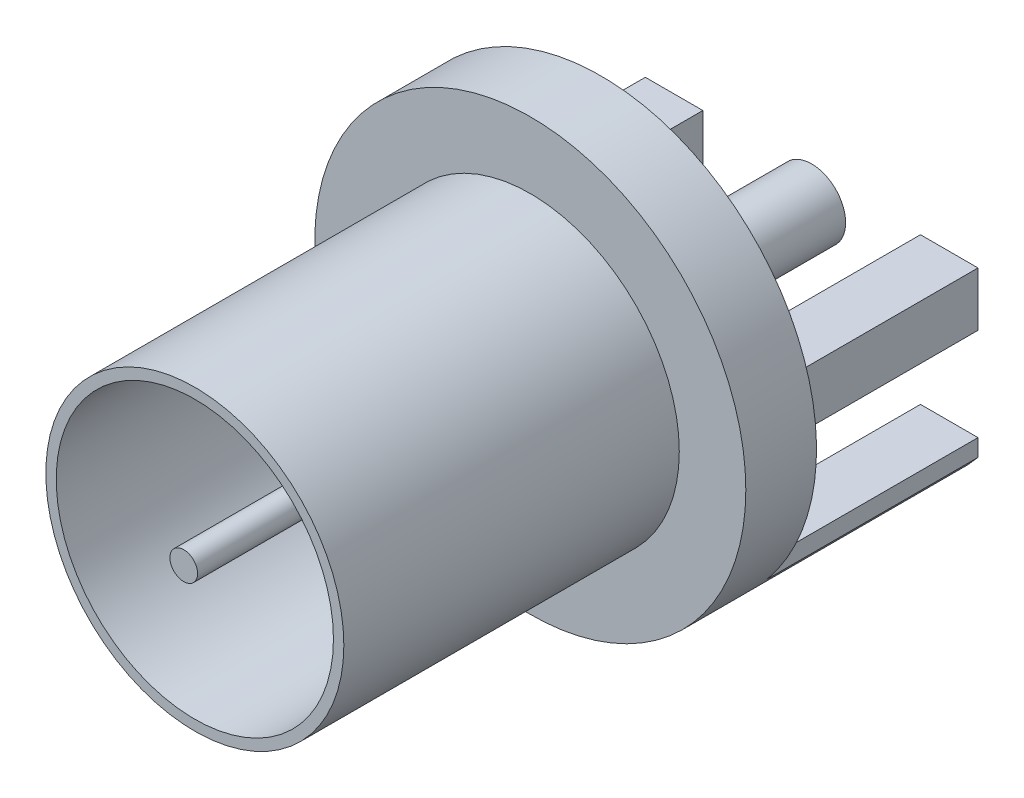
ISO-10303-21;
HEADER;
FILE_DESCRIPTION(('STEP AP214'),'2;1');
FILE_NAME('part.step','',(''),(''),'','','');
FILE_SCHEMA(('AUTOMOTIVE_DESIGN { 1 0 10303 214 1 1 1 1 }'));
ENDSEC;
DATA;
#1=APPLICATION_CONTEXT('core data for automotive mechanical design processes');
#2=APPLICATION_PROTOCOL_DEFINITION('international standard','automotive_design',2000,#1);
#3=PRODUCT_CONTEXT('',#1,'mechanical');
#4=PRODUCT('Part','Part','',(#3));
#5=PRODUCT_RELATED_PRODUCT_CATEGORY('part','',(#4));
#6=PRODUCT_DEFINITION_FORMATION('','',#4);
#7=PRODUCT_DEFINITION_CONTEXT('part definition',#1,'design');
#8=PRODUCT_DEFINITION('design','',#6,#7);
#9=PRODUCT_DEFINITION_SHAPE('','',#8);
#10=(LENGTH_UNIT() NAMED_UNIT(*) SI_UNIT(.MILLI.,.METRE.));
#11=(NAMED_UNIT(*) PLANE_ANGLE_UNIT() SI_UNIT($,.RADIAN.));
#12=(NAMED_UNIT(*) SI_UNIT($,.STERADIAN.) SOLID_ANGLE_UNIT());
#13=UNCERTAINTY_MEASURE_WITH_UNIT(LENGTH_MEASURE(1.E-05),#10,'distance_accuracy_value','');
#14=(GEOMETRIC_REPRESENTATION_CONTEXT(3) GLOBAL_UNCERTAINTY_ASSIGNED_CONTEXT((#13)) GLOBAL_UNIT_ASSIGNED_CONTEXT((#10,
#11,#12)) REPRESENTATION_CONTEXT('',''));
#15=CARTESIAN_POINT('',(0.,0.,0.));
#16=DIRECTION('',(0.,0.,1.));
#17=DIRECTION('',(1.,0.,0.));
#18=AXIS2_PLACEMENT_3D('',#15,#16,#17);
#19=CARTESIAN_POINT('',(0.,0.,1.2954));
#20=DIRECTION('',(0.,0.,1.));
#21=DIRECTION('',(1.,0.,0.));
#22=AXIS2_PLACEMENT_3D('',#19,#20,#21);
#23=PLANE('',#22);
#24=CARTESIAN_POINT('',(0.,0.,1.2954));
#25=DIRECTION('',(0.,0.,1.));
#26=DIRECTION('',(1.,0.,0.));
#27=AXIS2_PLACEMENT_3D('',#24,#25,#26);
#28=CIRCLE('',#27,2.54);
#29=CARTESIAN_POINT('',(2.54,0.,1.2954));
#30=VERTEX_POINT('',#29);
#31=EDGE_CURVE('E44',#30,#30,#28,.F.);
#32=ORIENTED_EDGE('',*,*,#31,.F.);
#33=EDGE_LOOP('',(#32));
#34=FACE_BOUND('',#33,.T.);
#35=CARTESIAN_POINT('',(0.,0.,1.2954));
#36=DIRECTION('',(0.,0.,1.));
#37=DIRECTION('',(1.,0.,0.));
#38=AXIS2_PLACEMENT_3D('',#35,#36,#37);
#39=CIRCLE('',#38,0.254);
#40=CARTESIAN_POINT('',(0.254,0.,1.2954));
#41=VERTEX_POINT('',#40);
#42=EDGE_CURVE('E291',#41,#41,#39,.T.);
#43=ORIENTED_EDGE('',*,*,#42,.F.);
#44=EDGE_LOOP('',(#43));
#45=FACE_BOUND('',#44,.T.);
#46=ADVANCED_FACE('F36',(#34,#45),#23,.T.);
#47=CARTESIAN_POINT('',(0.,0.,0.));
#48=DIRECTION('',(0.,0.,1.));
#49=DIRECTION('',(1.,0.,0.));
#50=AXIS2_PLACEMENT_3D('',#47,#48,#49);
#51=PLANE('',#50);
#52=DIRECTION('',(0.,-1.,0.));
#53=VECTOR('',#52,1.);
#54=CARTESIAN_POINT('',(-1.9939,-2.1971,0.));
#55=LINE('',#54,#53);
#56=CARTESIAN_POINT('',(-1.9939,-2.1971,0.));
#57=VERTEX_POINT('',#56);
#58=CARTESIAN_POINT('',(-1.9939,-3.40947105575044,0.));
#59=VERTEX_POINT('',#58);
#60=EDGE_CURVE('E51',#57,#59,#55,.T.);
#61=ORIENTED_EDGE('',*,*,#60,.F.);
#62=DIRECTION('',(1.,0.,0.));
#63=VECTOR('',#62,1.);
#64=CARTESIAN_POINT('',(-1.9939,-2.1971,0.));
#65=LINE('',#64,#63);
#66=CARTESIAN_POINT('',(-3.048,-2.1971,0.));
#67=VERTEX_POINT('',#66);
#68=EDGE_CURVE('E166',#67,#57,#65,.T.);
#69=ORIENTED_EDGE('',*,*,#68,.F.);
#70=DIRECTION('',(0.,1.,0.));
#71=VECTOR('',#70,1.);
#72=CARTESIAN_POINT('',(-3.048,-2.1971,0.));
#73=LINE('',#72,#71);
#74=CARTESIAN_POINT('',(-3.048,-2.51193672093865,0.));
#75=VERTEX_POINT('',#74);
#76=EDGE_CURVE('E305',#75,#67,#73,.T.);
#77=ORIENTED_EDGE('',*,*,#76,.F.);
#78=CARTESIAN_POINT('',(0.,0.,0.));
#79=DIRECTION('',(0.,0.,1.));
#80=DIRECTION('',(1.,0.,0.));
#81=AXIS2_PLACEMENT_3D('',#78,#79,#80);
#82=CIRCLE('',#81,3.9497);
#83=CARTESIAN_POINT('',(3.048,-2.51193672093865,0.));
#84=VERTEX_POINT('',#83);
#85=EDGE_CURVE('E278',#84,#75,#82,.T.);
#86=ORIENTED_EDGE('',*,*,#85,.F.);
#87=DIRECTION('',(0.,-1.,0.));
#88=VECTOR('',#87,1.);
#89=CARTESIAN_POINT('',(3.048,-2.1971,0.));
#90=LINE('',#89,#88);
#91=CARTESIAN_POINT('',(3.048,-2.1971,0.));
#92=VERTEX_POINT('',#91);
#93=EDGE_CURVE('E181',#92,#84,#90,.T.);
#94=ORIENTED_EDGE('',*,*,#93,.F.);
#95=DIRECTION('',(1.,0.,0.));
#96=VECTOR('',#95,1.);
#97=CARTESIAN_POINT('',(1.9939,-2.1971,0.));
#98=LINE('',#97,#96);
#99=CARTESIAN_POINT('',(1.9939,-2.1971,0.));
#100=VERTEX_POINT('',#99);
#101=EDGE_CURVE('E171',#100,#92,#98,.T.);
#102=ORIENTED_EDGE('',*,*,#101,.F.);
#103=DIRECTION('',(0.,1.,0.));
#104=VECTOR('',#103,1.);
#105=CARTESIAN_POINT('',(1.9939,-3.40947105575044,0.));
#106=LINE('',#105,#104);
#107=CARTESIAN_POINT('',(1.9939,-3.40947105575044,0.));
#108=VERTEX_POINT('',#107);
#109=EDGE_CURVE('E169',#108,#100,#106,.T.);
#110=ORIENTED_EDGE('',*,*,#109,.F.);
#111=EDGE_CURVE('E272',#59,#108,#82,.T.);
#112=ORIENTED_EDGE('',*,*,#111,.F.);
#113=EDGE_LOOP('',(#61,#69,#77,#86,#94,#102,#110,#112));
#114=FACE_BOUND('',#113,.T.);
#115=DIRECTION('',(0.,-1.,0.));
#116=VECTOR('',#115,1.);
#117=CARTESIAN_POINT('',(-1.9939,0.472898063786876,0.));
#118=LINE('',#117,#116);
#119=CARTESIAN_POINT('',(-1.9939,0.472898063786876,0.));
#120=VERTEX_POINT('',#119);
#121=CARTESIAN_POINT('',(-1.9939,-0.4953,0.));
#122=VERTEX_POINT('',#121);
#123=EDGE_CURVE('E199',#120,#122,#118,.T.);
#124=ORIENTED_EDGE('',*,*,#123,.F.);
#125=DIRECTION('',(1.,0.,0.));
#126=VECTOR('',#125,1.);
#127=CARTESIAN_POINT('',(-1.9939,0.472898063786876,0.));
#128=LINE('',#127,#126);
#129=CARTESIAN_POINT('',(-3.048,0.472898063786876,0.));
#130=VERTEX_POINT('',#129);
#131=EDGE_CURVE('E204',#130,#120,#128,.T.);
#132=ORIENTED_EDGE('',*,*,#131,.F.);
#133=DIRECTION('',(0.,1.,0.));
#134=VECTOR('',#133,1.);
#135=CARTESIAN_POINT('',(-3.048,0.472898063786876,0.));
#136=LINE('',#135,#134);
#137=CARTESIAN_POINT('',(-3.048,-0.4953,0.));
#138=VERTEX_POINT('',#137);
#139=EDGE_CURVE('E216',#138,#130,#136,.T.);
#140=ORIENTED_EDGE('',*,*,#139,.F.);
#141=DIRECTION('',(-1.,0.,0.));
#142=VECTOR('',#141,1.);
#143=CARTESIAN_POINT('',(-1.9939,-0.4953,0.));
#144=LINE('',#143,#142);
#145=EDGE_CURVE('E213',#122,#138,#144,.T.);
#146=ORIENTED_EDGE('',*,*,#145,.F.);
#147=EDGE_LOOP('',(#124,#132,#140,#146));
#148=FACE_BOUND('',#147,.T.);
#149=DIRECTION('',(0.,-1.,0.));
#150=VECTOR('',#149,1.);
#151=CARTESIAN_POINT('',(3.048,0.4953,0.));
#152=LINE('',#151,#150);
#153=CARTESIAN_POINT('',(3.048,0.4953,0.));
#154=VERTEX_POINT('',#153);
#155=CARTESIAN_POINT('',(3.048,-0.4953,0.));
#156=VERTEX_POINT('',#155);
#157=EDGE_CURVE('E232',#154,#156,#152,.T.);
#158=ORIENTED_EDGE('',*,*,#157,.F.);
#159=DIRECTION('',(1.,0.,0.));
#160=VECTOR('',#159,1.);
#161=CARTESIAN_POINT('',(3.048,0.4953,0.));
#162=LINE('',#161,#160);
#163=CARTESIAN_POINT('',(1.9939,0.4953,0.));
#164=VERTEX_POINT('',#163);
#165=EDGE_CURVE('E237',#164,#154,#162,.T.);
#166=ORIENTED_EDGE('',*,*,#165,.F.);
#167=DIRECTION('',(0.,1.,0.));
#168=VECTOR('',#167,1.);
#169=CARTESIAN_POINT('',(1.9939,0.4953,0.));
#170=LINE('',#169,#168);
#171=CARTESIAN_POINT('',(1.9939,-0.4953,0.));
#172=VERTEX_POINT('',#171);
#173=EDGE_CURVE('E249',#172,#164,#170,.T.);
#174=ORIENTED_EDGE('',*,*,#173,.F.);
#175=DIRECTION('',(-1.,0.,0.));
#176=VECTOR('',#175,1.);
#177=CARTESIAN_POINT('',(3.048,-0.4953,0.));
#178=LINE('',#177,#176);
#179=EDGE_CURVE('E246',#156,#172,#178,.T.);
#180=ORIENTED_EDGE('',*,*,#179,.F.);
#181=EDGE_LOOP('',(#158,#166,#174,#180));
#182=FACE_BOUND('',#181,.T.);
#183=CARTESIAN_POINT('',(0.,0.,0.));
#184=DIRECTION('',(0.,0.,1.));
#185=DIRECTION('',(1.,0.,0.));
#186=AXIS2_PLACEMENT_3D('',#183,#184,#185);
#187=CIRCLE('',#186,0.6223);
#188=CARTESIAN_POINT('',(0.6223,0.,0.));
#189=VERTEX_POINT('',#188);
#190=EDGE_CURVE('E11',#189,#189,#187,.F.);
#191=ORIENTED_EDGE('',*,*,#190,.F.);
#192=EDGE_LOOP('',(#191));
#193=FACE_BOUND('',#192,.T.);
#194=ADVANCED_FACE('F286',(#114,#148,#182,#193),#51,.F.);
#195=CARTESIAN_POINT('',(0.,0.,1.2954));
#196=DIRECTION('',(0.,0.,1.));
#197=DIRECTION('',(1.,0.,0.));
#198=AXIS2_PLACEMENT_3D('',#195,#196,#197);
#199=CIRCLE('',#198,3.9497);
#200=CARTESIAN_POINT('',(3.9497,0.,1.2954));
#201=VERTEX_POINT('',#200);
#202=EDGE_CURVE('E275',#201,#201,#199,.T.);
#203=ORIENTED_EDGE('',*,*,#202,.T.);
#204=EDGE_LOOP('',(#203));
#205=FACE_BOUND('',#204,.T.);
#206=CARTESIAN_POINT('',(0.,0.,1.2954));
#207=DIRECTION('',(0.,0.,1.));
#208=DIRECTION('',(1.,0.,0.));
#209=AXIS2_PLACEMENT_3D('',#206,#207,#208);
#210=CIRCLE('',#209,2.7305);
#211=CARTESIAN_POINT('',(2.7305,0.,1.2954));
#212=VERTEX_POINT('',#211);
#213=EDGE_CURVE('E268',#212,#212,#210,.T.);
#214=ORIENTED_EDGE('',*,*,#213,.F.);
#215=EDGE_LOOP('',(#214));
#216=FACE_BOUND('',#215,.T.);
#217=ADVANCED_FACE('F288',(#205,#216),#23,.T.);
#218=CARTESIAN_POINT('',(0.,0.,1.2954));
#219=DIRECTION('',(0.,0.,-1.));
#220=DIRECTION('',(-1.,0.,0.));
#221=AXIS2_PLACEMENT_3D('',#218,#219,#220);
#222=CYLINDRICAL_SURFACE('',#221,3.9497);
#223=ORIENTED_EDGE('',*,*,#202,.F.);
#224=EDGE_LOOP('',(#223));
#225=FACE_BOUND('',#224,.T.);
#226=ORIENTED_EDGE('',*,*,#85,.T.);
#227=DIRECTION('',(0.,0.,1.));
#228=VECTOR('',#227,1.);
#229=CARTESIAN_POINT('',(-3.048,-2.51193672093865,-3.8608));
#230=LINE('',#229,#228);
#231=CARTESIAN_POINT('',(-3.048,-2.51193672093865,-3.8608));
#232=VERTEX_POINT('',#231);
#233=EDGE_CURVE('E155',#232,#75,#230,.T.);
#234=ORIENTED_EDGE('',*,*,#233,.F.);
#235=CARTESIAN_POINT('',(0.,0.,-3.8608));
#236=DIRECTION('',(0.,0.,-1.));
#237=DIRECTION('',(-1.,0.,0.));
#238=AXIS2_PLACEMENT_3D('',#235,#236,#237);
#239=CIRCLE('',#238,3.9497);
#240=CARTESIAN_POINT('',(-1.9939,-3.40947105575044,-3.8608));
#241=VERTEX_POINT('',#240);
#242=EDGE_CURVE('E151',#241,#232,#239,.T.);
#243=ORIENTED_EDGE('',*,*,#242,.F.);
#244=DIRECTION('',(0.,0.,1.));
#245=VECTOR('',#244,1.);
#246=CARTESIAN_POINT('',(-1.9939,-3.40947105575044,-3.8608));
#247=LINE('',#246,#245);
#248=EDGE_CURVE('E153',#241,#59,#247,.T.);
#249=ORIENTED_EDGE('',*,*,#248,.T.);
#250=ORIENTED_EDGE('',*,*,#111,.T.);
#251=DIRECTION('',(0.,0.,1.));
#252=VECTOR('',#251,1.);
#253=CARTESIAN_POINT('',(1.9939,-3.40947105575044,-3.8608));
#254=LINE('',#253,#252);
#255=CARTESIAN_POINT('',(1.9939,-3.40947105575044,-3.8608));
#256=VERTEX_POINT('',#255);
#257=EDGE_CURVE('E196',#256,#108,#254,.T.);
#258=ORIENTED_EDGE('',*,*,#257,.F.);
#259=CARTESIAN_POINT('',(0.,0.,-3.8608));
#260=DIRECTION('',(0.,0.,-1.));
#261=DIRECTION('',(-1.,0.,0.));
#262=AXIS2_PLACEMENT_3D('',#259,#260,#261);
#263=CIRCLE('',#262,3.9497);
#264=CARTESIAN_POINT('',(3.048,-2.51193672093865,-3.8608));
#265=VERTEX_POINT('',#264);
#266=EDGE_CURVE('E177',#265,#256,#263,.T.);
#267=ORIENTED_EDGE('',*,*,#266,.F.);
#268=DIRECTION('',(0.,0.,1.));
#269=VECTOR('',#268,1.);
#270=CARTESIAN_POINT('',(3.048,-2.51193672093865,-3.8608));
#271=LINE('',#270,#269);
#272=EDGE_CURVE('E59',#265,#84,#271,.T.);
#273=ORIENTED_EDGE('',*,*,#272,.T.);
#274=EDGE_LOOP('',(#226,#234,#243,#249,#250,#258,#267,#273));
#275=FACE_BOUND('',#274,.T.);
#276=ADVANCED_FACE('F38',(#225,#275),#222,.T.);
#277=CARTESIAN_POINT('',(0.,0.,7.4422));
#278=DIRECTION('',(0.,0.,1.));
#279=DIRECTION('',(1.,0.,0.));
#280=AXIS2_PLACEMENT_3D('',#277,#278,#279);
#281=PLANE('',#280);
#282=CARTESIAN_POINT('',(0.,0.,7.4422));
#283=DIRECTION('',(0.,0.,1.));
#284=DIRECTION('',(1.,0.,0.));
#285=AXIS2_PLACEMENT_3D('',#282,#283,#284);
#286=CIRCLE('',#285,2.7305);
#287=CARTESIAN_POINT('',(2.7305,0.,7.4422));
#288=VERTEX_POINT('',#287);
#289=EDGE_CURVE('E269',#288,#288,#286,.T.);
#290=ORIENTED_EDGE('',*,*,#289,.T.);
#291=EDGE_LOOP('',(#290));
#292=FACE_BOUND('',#291,.T.);
#293=CARTESIAN_POINT('',(0.,0.,7.4422));
#294=DIRECTION('',(0.,0.,1.));
#295=DIRECTION('',(1.,0.,0.));
#296=AXIS2_PLACEMENT_3D('',#293,#294,#295);
#297=CIRCLE('',#296,2.54);
#298=CARTESIAN_POINT('',(2.54,0.,7.4422));
#299=VERTEX_POINT('',#298);
#300=EDGE_CURVE('E265',#299,#299,#297,.T.);
#301=ORIENTED_EDGE('',*,*,#300,.F.);
#302=EDGE_LOOP('',(#301));
#303=FACE_BOUND('',#302,.T.);
#304=ADVANCED_FACE('F388',(#292,#303),#281,.T.);
#305=CARTESIAN_POINT('',(0.,0.,7.4422));
#306=DIRECTION('',(0.,0.,-1.));
#307=DIRECTION('',(-1.,0.,0.));
#308=AXIS2_PLACEMENT_3D('',#305,#306,#307);
#309=CYLINDRICAL_SURFACE('',#308,2.7305);
#310=ORIENTED_EDGE('',*,*,#289,.F.);
#311=EDGE_LOOP('',(#310));
#312=FACE_BOUND('',#311,.T.);
#313=ORIENTED_EDGE('',*,*,#213,.T.);
#314=EDGE_LOOP('',(#313));
#315=FACE_BOUND('',#314,.T.);
#316=ADVANCED_FACE('F386',(#312,#315),#309,.T.);
#317=CARTESIAN_POINT('',(0.,0.,7.4422));
#318=DIRECTION('',(0.,0.,-1.));
#319=DIRECTION('',(-1.,0.,0.));
#320=AXIS2_PLACEMENT_3D('',#317,#318,#319);
#321=CYLINDRICAL_SURFACE('',#320,2.54);
#322=ORIENTED_EDGE('',*,*,#300,.T.);
#323=EDGE_LOOP('',(#322));
#324=FACE_BOUND('',#323,.T.);
#325=ORIENTED_EDGE('',*,*,#31,.T.);
#326=EDGE_LOOP('',(#325));
#327=FACE_BOUND('',#326,.T.);
#328=ADVANCED_FACE('F282',(#324,#327),#321,.F.);
#329=CARTESIAN_POINT('',(3.048,0.4953,-3.8608));
#330=DIRECTION('',(-1.,0.,0.));
#331=DIRECTION('',(0.,0.,1.));
#332=AXIS2_PLACEMENT_3D('',#329,#330,#331);
#333=PLANE('',#332);
#334=ORIENTED_EDGE('',*,*,#157,.T.);
#335=DIRECTION('',(0.,0.,1.));
#336=VECTOR('',#335,1.);
#337=CARTESIAN_POINT('',(3.048,-0.4953,-3.8608));
#338=LINE('',#337,#336);
#339=CARTESIAN_POINT('',(3.048,-0.4953,-3.8608));
#340=VERTEX_POINT('',#339);
#341=EDGE_CURVE('E262',#340,#156,#338,.T.);
#342=ORIENTED_EDGE('',*,*,#341,.F.);
#343=DIRECTION('',(0.,-1.,0.));
#344=VECTOR('',#343,1.);
#345=CARTESIAN_POINT('',(3.048,0.4953,-3.8608));
#346=LINE('',#345,#344);
#347=CARTESIAN_POINT('',(3.048,0.4953,-3.8608));
#348=VERTEX_POINT('',#347);
#349=EDGE_CURVE('E233',#348,#340,#346,.T.);
#350=ORIENTED_EDGE('',*,*,#349,.F.);
#351=DIRECTION('',(0.,0.,1.));
#352=VECTOR('',#351,1.);
#353=CARTESIAN_POINT('',(3.048,0.4953,-3.8608));
#354=LINE('',#353,#352);
#355=EDGE_CURVE('E243',#348,#154,#354,.T.);
#356=ORIENTED_EDGE('',*,*,#355,.T.);
#357=EDGE_LOOP('',(#334,#342,#350,#356));
#358=FACE_BOUND('',#357,.T.);
#359=ADVANCED_FACE('F379',(#358),#333,.F.);
#360=CARTESIAN_POINT('',(3.048,-0.4953,-3.8608));
#361=DIRECTION('',(0.,1.,0.));
#362=DIRECTION('',(0.,0.,1.));
#363=AXIS2_PLACEMENT_3D('',#360,#361,#362);
#364=PLANE('',#363);
#365=ORIENTED_EDGE('',*,*,#179,.T.);
#366=DIRECTION('',(0.,0.,1.));
#367=VECTOR('',#366,1.);
#368=CARTESIAN_POINT('',(1.9939,-0.4953,-3.8608));
#369=LINE('',#368,#367);
#370=CARTESIAN_POINT('',(1.9939,-0.4953,-3.8608));
#371=VERTEX_POINT('',#370);
#372=EDGE_CURVE('E259',#371,#172,#369,.T.);
#373=ORIENTED_EDGE('',*,*,#372,.F.);
#374=DIRECTION('',(-1.,0.,0.));
#375=VECTOR('',#374,1.);
#376=CARTESIAN_POINT('',(3.048,-0.4953,-3.8608));
#377=LINE('',#376,#375);
#378=EDGE_CURVE('E236',#340,#371,#377,.T.);
#379=ORIENTED_EDGE('',*,*,#378,.F.);
#380=ORIENTED_EDGE('',*,*,#341,.T.);
#381=EDGE_LOOP('',(#365,#373,#379,#380));
#382=FACE_BOUND('',#381,.T.);
#383=ADVANCED_FACE('F375',(#382),#364,.F.);
#384=CARTESIAN_POINT('',(1.9939,0.4953,-3.8608));
#385=DIRECTION('',(1.,0.,0.));
#386=DIRECTION('',(0.,0.,-1.));
#387=AXIS2_PLACEMENT_3D('',#384,#385,#386);
#388=PLANE('',#387);
#389=ORIENTED_EDGE('',*,*,#173,.T.);
#390=DIRECTION('',(0.,0.,1.));
#391=VECTOR('',#390,1.);
#392=CARTESIAN_POINT('',(1.9939,0.4953,-3.8608));
#393=LINE('',#392,#391);
#394=CARTESIAN_POINT('',(1.9939,0.4953,-3.8608));
#395=VERTEX_POINT('',#394);
#396=EDGE_CURVE('E256',#395,#164,#393,.T.);
#397=ORIENTED_EDGE('',*,*,#396,.F.);
#398=DIRECTION('',(0.,1.,0.));
#399=VECTOR('',#398,1.);
#400=CARTESIAN_POINT('',(1.9939,0.4953,-3.8608));
#401=LINE('',#400,#399);
#402=EDGE_CURVE('E239',#371,#395,#401,.T.);
#403=ORIENTED_EDGE('',*,*,#402,.F.);
#404=ORIENTED_EDGE('',*,*,#372,.T.);
#405=EDGE_LOOP('',(#389,#397,#403,#404));
#406=FACE_BOUND('',#405,.T.);
#407=ADVANCED_FACE('F371',(#406),#388,.F.);
#408=CARTESIAN_POINT('',(3.048,0.4953,-3.8608));
#409=DIRECTION('',(0.,-1.,0.));
#410=DIRECTION('',(0.,0.,-1.));
#411=AXIS2_PLACEMENT_3D('',#408,#409,#410);
#412=PLANE('',#411);
#413=ORIENTED_EDGE('',*,*,#165,.T.);
#414=ORIENTED_EDGE('',*,*,#355,.F.);
#415=DIRECTION('',(1.,0.,0.));
#416=VECTOR('',#415,1.);
#417=CARTESIAN_POINT('',(3.048,0.4953,-3.8608));
#418=LINE('',#417,#416);
#419=EDGE_CURVE('E241',#395,#348,#418,.T.);
#420=ORIENTED_EDGE('',*,*,#419,.F.);
#421=ORIENTED_EDGE('',*,*,#396,.T.);
#422=EDGE_LOOP('',(#413,#414,#420,#421));
#423=FACE_BOUND('',#422,.T.);
#424=ADVANCED_FACE('F367',(#423),#412,.F.);
#425=CARTESIAN_POINT('',(0.,0.,-3.8608));
#426=DIRECTION('',(0.,0.,-1.));
#427=DIRECTION('',(-1.,0.,0.));
#428=AXIS2_PLACEMENT_3D('',#425,#426,#427);
#429=PLANE('',#428);
#430=ORIENTED_EDGE('',*,*,#349,.T.);
#431=ORIENTED_EDGE('',*,*,#378,.T.);
#432=ORIENTED_EDGE('',*,*,#402,.T.);
#433=ORIENTED_EDGE('',*,*,#419,.T.);
#434=EDGE_LOOP('',(#430,#431,#432,#433));
#435=FACE_BOUND('',#434,.T.);
#436=ADVANCED_FACE('F363',(#435),#429,.T.);
#437=CARTESIAN_POINT('',(-1.9939,0.472898063786876,-3.8608));
#438=DIRECTION('',(-1.,0.,0.));
#439=DIRECTION('',(0.,0.,1.));
#440=AXIS2_PLACEMENT_3D('',#437,#438,#439);
#441=PLANE('',#440);
#442=ORIENTED_EDGE('',*,*,#123,.T.);
#443=DIRECTION('',(0.,0.,1.));
#444=VECTOR('',#443,1.);
#445=CARTESIAN_POINT('',(-1.9939,-0.4953,-3.8608));
#446=LINE('',#445,#444);
#447=CARTESIAN_POINT('',(-1.9939,-0.4953,-3.8608));
#448=VERTEX_POINT('',#447);
#449=EDGE_CURVE('E229',#448,#122,#446,.T.);
#450=ORIENTED_EDGE('',*,*,#449,.F.);
#451=DIRECTION('',(0.,-1.,0.));
#452=VECTOR('',#451,1.);
#453=CARTESIAN_POINT('',(-1.9939,0.472898063786876,-3.8608));
#454=LINE('',#453,#452);
#455=CARTESIAN_POINT('',(-1.9939,0.472898063786876,-3.8608));
#456=VERTEX_POINT('',#455);
#457=EDGE_CURVE('E200',#456,#448,#454,.T.);
#458=ORIENTED_EDGE('',*,*,#457,.F.);
#459=DIRECTION('',(0.,0.,1.));
#460=VECTOR('',#459,1.);
#461=CARTESIAN_POINT('',(-1.9939,0.472898063786876,-3.8608));
#462=LINE('',#461,#460);
#463=EDGE_CURVE('E210',#456,#120,#462,.T.);
#464=ORIENTED_EDGE('',*,*,#463,.T.);
#465=EDGE_LOOP('',(#442,#450,#458,#464));
#466=FACE_BOUND('',#465,.T.);
#467=ADVANCED_FACE('F359',(#466),#441,.F.);
#468=CARTESIAN_POINT('',(-1.9939,-0.4953,-3.8608));
#469=DIRECTION('',(0.,1.,0.));
#470=DIRECTION('',(0.,0.,1.));
#471=AXIS2_PLACEMENT_3D('',#468,#469,#470);
#472=PLANE('',#471);
#473=ORIENTED_EDGE('',*,*,#145,.T.);
#474=DIRECTION('',(0.,0.,1.));
#475=VECTOR('',#474,1.);
#476=CARTESIAN_POINT('',(-3.048,-0.4953,-3.8608));
#477=LINE('',#476,#475);
#478=CARTESIAN_POINT('',(-3.048,-0.4953,-3.8608));
#479=VERTEX_POINT('',#478);
#480=EDGE_CURVE('E226',#479,#138,#477,.T.);
#481=ORIENTED_EDGE('',*,*,#480,.F.);
#482=DIRECTION('',(-1.,0.,0.));
#483=VECTOR('',#482,1.);
#484=CARTESIAN_POINT('',(-1.9939,-0.4953,-3.8608));
#485=LINE('',#484,#483);
#486=EDGE_CURVE('E203',#448,#479,#485,.T.);
#487=ORIENTED_EDGE('',*,*,#486,.F.);
#488=ORIENTED_EDGE('',*,*,#449,.T.);
#489=EDGE_LOOP('',(#473,#481,#487,#488));
#490=FACE_BOUND('',#489,.T.);
#491=ADVANCED_FACE('F355',(#490),#472,.F.);
#492=CARTESIAN_POINT('',(-3.048,0.472898063786876,-3.8608));
#493=DIRECTION('',(1.,0.,0.));
#494=DIRECTION('',(0.,0.,-1.));
#495=AXIS2_PLACEMENT_3D('',#492,#493,#494);
#496=PLANE('',#495);
#497=ORIENTED_EDGE('',*,*,#139,.T.);
#498=DIRECTION('',(0.,0.,1.));
#499=VECTOR('',#498,1.);
#500=CARTESIAN_POINT('',(-3.048,0.472898063786876,-3.8608));
#501=LINE('',#500,#499);
#502=CARTESIAN_POINT('',(-3.048,0.472898063786876,-3.8608));
#503=VERTEX_POINT('',#502);
#504=EDGE_CURVE('E223',#503,#130,#501,.T.);
#505=ORIENTED_EDGE('',*,*,#504,.F.);
#506=DIRECTION('',(0.,1.,0.));
#507=VECTOR('',#506,1.);
#508=CARTESIAN_POINT('',(-3.048,0.472898063786876,-3.8608));
#509=LINE('',#508,#507);
#510=EDGE_CURVE('E206',#479,#503,#509,.T.);
#511=ORIENTED_EDGE('',*,*,#510,.F.);
#512=ORIENTED_EDGE('',*,*,#480,.T.);
#513=EDGE_LOOP('',(#497,#505,#511,#512));
#514=FACE_BOUND('',#513,.T.);
#515=ADVANCED_FACE('F351',(#514),#496,.F.);
#516=CARTESIAN_POINT('',(-1.9939,0.472898063786876,-3.8608));
#517=DIRECTION('',(0.,-1.,0.));
#518=DIRECTION('',(0.,0.,-1.));
#519=AXIS2_PLACEMENT_3D('',#516,#517,#518);
#520=PLANE('',#519);
#521=ORIENTED_EDGE('',*,*,#131,.T.);
#522=ORIENTED_EDGE('',*,*,#463,.F.);
#523=DIRECTION('',(1.,0.,0.));
#524=VECTOR('',#523,1.);
#525=CARTESIAN_POINT('',(-1.9939,0.472898063786876,-3.8608));
#526=LINE('',#525,#524);
#527=EDGE_CURVE('E208',#503,#456,#526,.T.);
#528=ORIENTED_EDGE('',*,*,#527,.F.);
#529=ORIENTED_EDGE('',*,*,#504,.T.);
#530=EDGE_LOOP('',(#521,#522,#528,#529));
#531=FACE_BOUND('',#530,.T.);
#532=ADVANCED_FACE('F347',(#531),#520,.F.);
#533=CARTESIAN_POINT('',(0.,0.,-3.8608));
#534=DIRECTION('',(0.,0.,-1.));
#535=DIRECTION('',(-1.,0.,0.));
#536=AXIS2_PLACEMENT_3D('',#533,#534,#535);
#537=PLANE('',#536);
#538=ORIENTED_EDGE('',*,*,#457,.T.);
#539=ORIENTED_EDGE('',*,*,#486,.T.);
#540=ORIENTED_EDGE('',*,*,#510,.T.);
#541=ORIENTED_EDGE('',*,*,#527,.T.);
#542=EDGE_LOOP('',(#538,#539,#540,#541));
#543=FACE_BOUND('',#542,.T.);
#544=ADVANCED_FACE('F341',(#543),#537,.T.);
#545=CARTESIAN_POINT('',(1.9939,-3.40947105575044,-3.8608));
#546=DIRECTION('',(1.,0.,0.));
#547=DIRECTION('',(0.,1.,0.));
#548=AXIS2_PLACEMENT_3D('',#545,#546,#547);
#549=PLANE('',#548);
#550=ORIENTED_EDGE('',*,*,#109,.T.);
#551=DIRECTION('',(0.,0.,1.));
#552=VECTOR('',#551,1.);
#553=CARTESIAN_POINT('',(1.9939,-2.1971,-3.8608));
#554=LINE('',#553,#552);
#555=CARTESIAN_POINT('',(1.9939,-2.1971,-3.8608));
#556=VERTEX_POINT('',#555);
#557=EDGE_CURVE('E193',#556,#100,#554,.T.);
#558=ORIENTED_EDGE('',*,*,#557,.F.);
#559=DIRECTION('',(0.,1.,0.));
#560=VECTOR('',#559,1.);
#561=CARTESIAN_POINT('',(1.9939,-3.40947105575044,-3.8608));
#562=LINE('',#561,#560);
#563=EDGE_CURVE('E180',#256,#556,#562,.T.);
#564=ORIENTED_EDGE('',*,*,#563,.F.);
#565=ORIENTED_EDGE('',*,*,#257,.T.);
#566=EDGE_LOOP('',(#550,#558,#564,#565));
#567=FACE_BOUND('',#566,.T.);
#568=ADVANCED_FACE('F322',(#567),#549,.F.);
#569=CARTESIAN_POINT('',(1.9939,-2.1971,-3.8608));
#570=DIRECTION('',(0.,-1.,0.));
#571=DIRECTION('',(0.,0.,-1.));
#572=AXIS2_PLACEMENT_3D('',#569,#570,#571);
#573=PLANE('',#572);
#574=ORIENTED_EDGE('',*,*,#101,.T.);
#575=DIRECTION('',(0.,0.,1.));
#576=VECTOR('',#575,1.);
#577=CARTESIAN_POINT('',(3.048,-2.1971,-3.8608));
#578=LINE('',#577,#576);
#579=CARTESIAN_POINT('',(3.048,-2.1971,-3.8608));
#580=VERTEX_POINT('',#579);
#581=EDGE_CURVE('E190',#580,#92,#578,.T.);
#582=ORIENTED_EDGE('',*,*,#581,.F.);
#583=DIRECTION('',(1.,0.,0.));
#584=VECTOR('',#583,1.);
#585=CARTESIAN_POINT('',(1.9939,-2.1971,-3.8608));
#586=LINE('',#585,#584);
#587=EDGE_CURVE('E183',#556,#580,#586,.T.);
#588=ORIENTED_EDGE('',*,*,#587,.F.);
#589=ORIENTED_EDGE('',*,*,#557,.T.);
#590=EDGE_LOOP('',(#574,#582,#588,#589));
#591=FACE_BOUND('',#590,.T.);
#592=ADVANCED_FACE('F333',(#591),#573,.F.);
#593=CARTESIAN_POINT('',(3.048,-2.1971,-3.8608));
#594=DIRECTION('',(-1.,0.,0.));
#595=DIRECTION('',(0.,0.,1.));
#596=AXIS2_PLACEMENT_3D('',#593,#594,#595);
#597=PLANE('',#596);
#598=ORIENTED_EDGE('',*,*,#93,.T.);
#599=ORIENTED_EDGE('',*,*,#272,.F.);
#600=DIRECTION('',(0.,-1.,0.));
#601=VECTOR('',#600,1.);
#602=CARTESIAN_POINT('',(3.048,-2.1971,-3.8608));
#603=LINE('',#602,#601);
#604=EDGE_CURVE('E185',#580,#265,#603,.T.);
#605=ORIENTED_EDGE('',*,*,#604,.F.);
#606=ORIENTED_EDGE('',*,*,#581,.T.);
#607=EDGE_LOOP('',(#598,#599,#605,#606));
#608=FACE_BOUND('',#607,.T.);
#609=ADVANCED_FACE('F330',(#608),#597,.F.);
#610=CARTESIAN_POINT('',(0.,0.,-3.8608));
#611=DIRECTION('',(0.,0.,-1.));
#612=DIRECTION('',(-1.,0.,0.));
#613=AXIS2_PLACEMENT_3D('',#610,#611,#612);
#614=PLANE('',#613);
#615=ORIENTED_EDGE('',*,*,#266,.T.);
#616=ORIENTED_EDGE('',*,*,#563,.T.);
#617=ORIENTED_EDGE('',*,*,#587,.T.);
#618=ORIENTED_EDGE('',*,*,#604,.T.);
#619=EDGE_LOOP('',(#615,#616,#617,#618));
#620=FACE_BOUND('',#619,.T.);
#621=ADVANCED_FACE('F326',(#620),#614,.T.);
#622=CARTESIAN_POINT('',(-1.9939,-2.1971,-3.8608));
#623=DIRECTION('',(-1.,0.,0.));
#624=DIRECTION('',(0.,0.,1.));
#625=AXIS2_PLACEMENT_3D('',#622,#623,#624);
#626=PLANE('',#625);
#627=ORIENTED_EDGE('',*,*,#60,.T.);
#628=ORIENTED_EDGE('',*,*,#248,.F.);
#629=DIRECTION('',(0.,-1.,0.));
#630=VECTOR('',#629,1.);
#631=CARTESIAN_POINT('',(-1.9939,-2.1971,-3.8608));
#632=LINE('',#631,#630);
#633=CARTESIAN_POINT('',(-1.9939,-2.1971,-3.8608));
#634=VERTEX_POINT('',#633);
#635=EDGE_CURVE('E159',#634,#241,#632,.T.);
#636=ORIENTED_EDGE('',*,*,#635,.F.);
#637=DIRECTION('',(0.,0.,1.));
#638=VECTOR('',#637,1.);
#639=CARTESIAN_POINT('',(-1.9939,-2.1971,-3.8608));
#640=LINE('',#639,#638);
#641=EDGE_CURVE('E303',#634,#57,#640,.T.);
#642=ORIENTED_EDGE('',*,*,#641,.T.);
#643=EDGE_LOOP('',(#627,#628,#636,#642));
#644=FACE_BOUND('',#643,.T.);
#645=ADVANCED_FACE('F168',(#644),#626,.F.);
#646=CARTESIAN_POINT('',(-3.048,-2.1971,-3.8608));
#647=DIRECTION('',(1.,0.,0.));
#648=DIRECTION('',(0.,0.,-1.));
#649=AXIS2_PLACEMENT_3D('',#646,#647,#648);
#650=PLANE('',#649);
#651=ORIENTED_EDGE('',*,*,#76,.T.);
#652=DIRECTION('',(0.,0.,1.));
#653=VECTOR('',#652,1.);
#654=CARTESIAN_POINT('',(-3.048,-2.1971,-3.8608));
#655=LINE('',#654,#653);
#656=CARTESIAN_POINT('',(-3.048,-2.1971,-3.8608));
#657=VERTEX_POINT('',#656);
#658=EDGE_CURVE('E173',#657,#67,#655,.T.);
#659=ORIENTED_EDGE('',*,*,#658,.F.);
#660=DIRECTION('',(0.,1.,0.));
#661=VECTOR('',#660,1.);
#662=CARTESIAN_POINT('',(-3.048,-2.1971,-3.8608));
#663=LINE('',#662,#661);
#664=EDGE_CURVE('E158',#232,#657,#663,.T.);
#665=ORIENTED_EDGE('',*,*,#664,.F.);
#666=ORIENTED_EDGE('',*,*,#233,.T.);
#667=EDGE_LOOP('',(#651,#659,#665,#666));
#668=FACE_BOUND('',#667,.T.);
#669=ADVANCED_FACE('F491',(#668),#650,.F.);
#670=CARTESIAN_POINT('',(-1.9939,-2.1971,-3.8608));
#671=DIRECTION('',(0.,-1.,0.));
#672=DIRECTION('',(0.,0.,-1.));
#673=AXIS2_PLACEMENT_3D('',#670,#671,#672);
#674=PLANE('',#673);
#675=ORIENTED_EDGE('',*,*,#68,.T.);
#676=ORIENTED_EDGE('',*,*,#641,.F.);
#677=DIRECTION('',(1.,0.,0.));
#678=VECTOR('',#677,1.);
#679=CARTESIAN_POINT('',(-1.9939,-2.1971,-3.8608));
#680=LINE('',#679,#678);
#681=EDGE_CURVE('E164',#657,#634,#680,.T.);
#682=ORIENTED_EDGE('',*,*,#681,.F.);
#683=ORIENTED_EDGE('',*,*,#658,.T.);
#684=EDGE_LOOP('',(#675,#676,#682,#683));
#685=FACE_BOUND('',#684,.T.);
#686=ADVANCED_FACE('F312',(#685),#674,.F.);
#687=CARTESIAN_POINT('',(0.,0.,-3.8608));
#688=DIRECTION('',(0.,0.,-1.));
#689=DIRECTION('',(-1.,0.,0.));
#690=AXIS2_PLACEMENT_3D('',#687,#688,#689);
#691=PLANE('',#690);
#692=ORIENTED_EDGE('',*,*,#635,.T.);
#693=ORIENTED_EDGE('',*,*,#242,.T.);
#694=ORIENTED_EDGE('',*,*,#664,.T.);
#695=ORIENTED_EDGE('',*,*,#681,.T.);
#696=EDGE_LOOP('',(#692,#693,#694,#695));
#697=FACE_BOUND('',#696,.T.);
#698=ADVANCED_FACE('F162',(#697),#691,.T.);
#699=CARTESIAN_POINT('',(0.,0.,-3.8608));
#700=DIRECTION('',(0.,0.,1.));
#701=DIRECTION('',(1.,0.,0.));
#702=AXIS2_PLACEMENT_3D('',#699,#700,#701);
#703=CYLINDRICAL_SURFACE('',#702,0.6223);
#704=CARTESIAN_POINT('',(0.,0.,-3.8608));
#705=DIRECTION('',(0.,0.,-1.));
#706=DIRECTION('',(-1.,0.,0.));
#707=AXIS2_PLACEMENT_3D('',#704,#705,#706);
#708=CIRCLE('',#707,0.6223);
#709=CARTESIAN_POINT('',(-0.6223,0.,-3.8608));
#710=VERTEX_POINT('',#709);
#711=EDGE_CURVE('E296',#710,#710,#708,.T.);
#712=ORIENTED_EDGE('',*,*,#711,.F.);
#713=EDGE_LOOP('',(#712));
#714=FACE_BOUND('',#713,.T.);
#715=ORIENTED_EDGE('',*,*,#190,.T.);
#716=EDGE_LOOP('',(#715));
#717=FACE_BOUND('',#716,.T.);
#718=ADVANCED_FACE('F515',(#714,#717),#703,.T.);
#719=CARTESIAN_POINT('',(0.,0.,-3.8608));
#720=DIRECTION('',(0.,0.,-1.));
#721=DIRECTION('',(-1.,0.,0.));
#722=AXIS2_PLACEMENT_3D('',#719,#720,#721);
#723=PLANE('',#722);
#724=ORIENTED_EDGE('',*,*,#711,.T.);
#725=EDGE_LOOP('',(#724));
#726=FACE_BOUND('',#725,.T.);
#727=ADVANCED_FACE('F529',(#726),#723,.T.);
#728=CARTESIAN_POINT('',(0.,0.,7.6454));
#729=DIRECTION('',(0.,0.,-1.));
#730=DIRECTION('',(-1.,0.,0.));
#731=AXIS2_PLACEMENT_3D('',#728,#729,#730);
#732=CYLINDRICAL_SURFACE('',#731,0.254);
#733=CARTESIAN_POINT('',(0.,0.,7.6454));
#734=DIRECTION('',(0.,0.,1.));
#735=DIRECTION('',(1.,0.,0.));
#736=AXIS2_PLACEMENT_3D('',#733,#734,#735);
#737=CIRCLE('',#736,0.254);
#738=CARTESIAN_POINT('',(0.254,0.,7.6454));
#739=VERTEX_POINT('',#738);
#740=EDGE_CURVE('E293',#739,#739,#737,.T.);
#741=ORIENTED_EDGE('',*,*,#740,.F.);
#742=EDGE_LOOP('',(#741));
#743=FACE_BOUND('',#742,.T.);
#744=ORIENTED_EDGE('',*,*,#42,.T.);
#745=EDGE_LOOP('',(#744));
#746=FACE_BOUND('',#745,.T.);
#747=ADVANCED_FACE('F539',(#743,#746),#732,.T.);
#748=CARTESIAN_POINT('',(0.,0.,7.6454));
#749=DIRECTION('',(0.,0.,1.));
#750=DIRECTION('',(1.,0.,0.));
#751=AXIS2_PLACEMENT_3D('',#748,#749,#750);
#752=PLANE('',#751);
#753=ORIENTED_EDGE('',*,*,#740,.T.);
#754=EDGE_LOOP('',(#753));
#755=FACE_BOUND('',#754,.T.);
#756=ADVANCED_FACE('F555',(#755),#752,.T.);
#757=CLOSED_SHELL('',(#46,#194,#217,#276,#304,#316,#328,#359,#383,#407,#424,#436,#467,#491,#515,
#532,#544,#568,#592,#609,#621,#645,#669,#686,#698,#718,#727,#747,#756));
#758=MANIFOLD_SOLID_BREP('B2',#757);
#759=ADVANCED_BREP_SHAPE_REPRESENTATION('',(#18,#758),#14);
#760=SHAPE_DEFINITION_REPRESENTATION(#9,#759);
ENDSEC;
END-ISO-10303-21;
